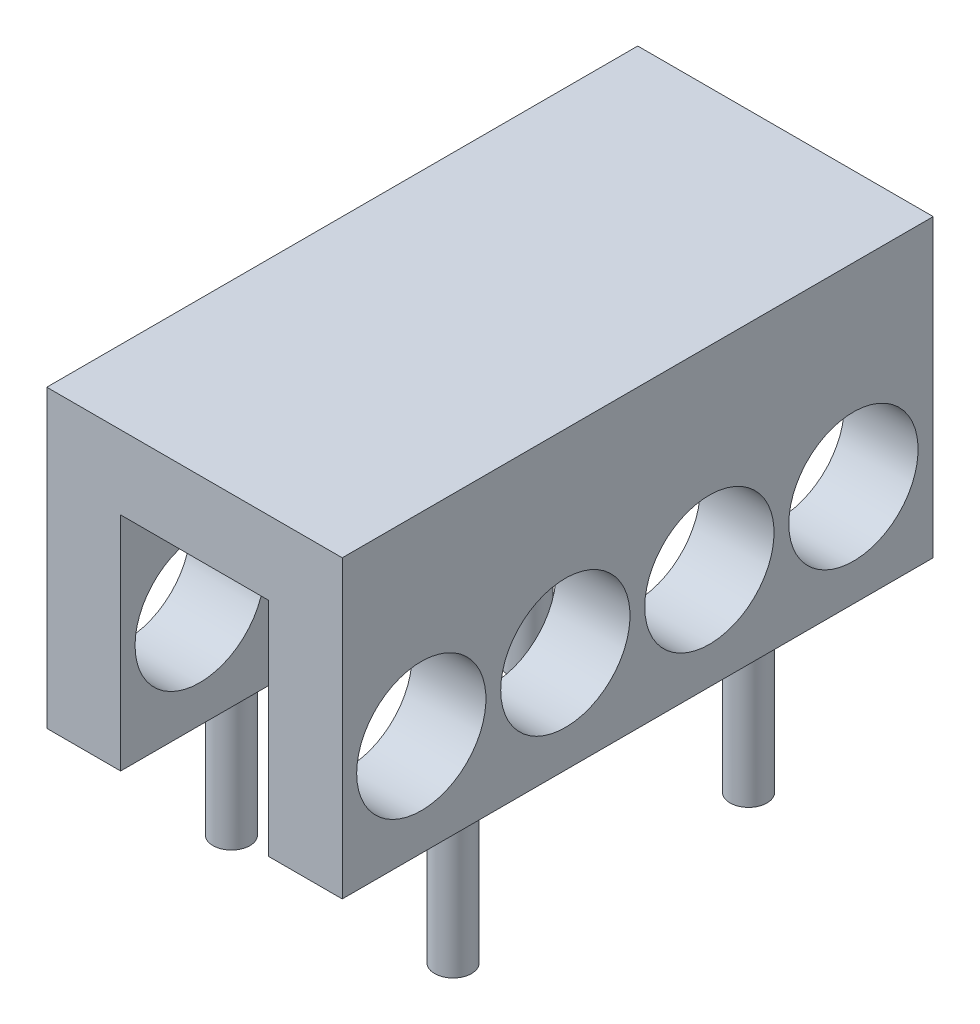
ISO-10303-21;
HEADER;
FILE_DESCRIPTION(('STEP AP214'),'2;1');
FILE_NAME('part.step','',(''),(''),'','','');
FILE_SCHEMA(('AUTOMOTIVE_DESIGN { 1 0 10303 214 1 1 1 1 }'));
ENDSEC;
DATA;
#1=APPLICATION_CONTEXT('core data for automotive mechanical design processes');
#2=APPLICATION_PROTOCOL_DEFINITION('international standard','automotive_design',2000,#1);
#3=PRODUCT_CONTEXT('',#1,'mechanical');
#4=PRODUCT('Part','Part','',(#3));
#5=PRODUCT_RELATED_PRODUCT_CATEGORY('part','',(#4));
#6=PRODUCT_DEFINITION_FORMATION('','',#4);
#7=PRODUCT_DEFINITION_CONTEXT('part definition',#1,'design');
#8=PRODUCT_DEFINITION('design','',#6,#7);
#9=PRODUCT_DEFINITION_SHAPE('','',#8);
#10=(LENGTH_UNIT() NAMED_UNIT(*) SI_UNIT(.MILLI.,.METRE.));
#11=(NAMED_UNIT(*) PLANE_ANGLE_UNIT() SI_UNIT($,.RADIAN.));
#12=(NAMED_UNIT(*) SI_UNIT($,.STERADIAN.) SOLID_ANGLE_UNIT());
#13=UNCERTAINTY_MEASURE_WITH_UNIT(LENGTH_MEASURE(1.E-05),#10,'distance_accuracy_value','');
#14=(GEOMETRIC_REPRESENTATION_CONTEXT(3) GLOBAL_UNCERTAINTY_ASSIGNED_CONTEXT((#13)) GLOBAL_UNIT_ASSIGNED_CONTEXT((#10,
#11,#12)) REPRESENTATION_CONTEXT('',''));
#15=CARTESIAN_POINT('',(0.,0.,0.));
#16=DIRECTION('',(0.,0.,1.));
#17=DIRECTION('',(1.,0.,0.));
#18=AXIS2_PLACEMENT_3D('',#15,#16,#17);
#19=CARTESIAN_POINT('',(12.7,0.,101.6));
#20=DIRECTION('',(0.,1.,0.));
#21=DIRECTION('',(-1.,0.,0.));
#22=AXIS2_PLACEMENT_3D('',#19,#20,#21);
#23=PLANE('',#22);
#24=CARTESIAN_POINT('',(6.35,0.,76.2));
#25=DIRECTION('',(0.,1.,0.));
#26=DIRECTION('',(-1.,0.,0.));
#27=AXIS2_PLACEMENT_3D('',#24,#25,#26);
#28=CIRCLE('',#27,3.175);
#29=CARTESIAN_POINT('',(3.175,0.,76.2));
#30=VERTEX_POINT('',#29);
#31=EDGE_CURVE('E190',#30,#30,#28,.F.);
#32=ORIENTED_EDGE('',*,*,#31,.F.);
#33=EDGE_LOOP('',(#32));
#34=FACE_BOUND('',#33,.T.);
#35=CARTESIAN_POINT('',(6.35,0.,25.4));
#36=DIRECTION('',(0.,1.,0.));
#37=DIRECTION('',(-1.,0.,0.));
#38=AXIS2_PLACEMENT_3D('',#35,#36,#37);
#39=CIRCLE('',#38,3.175);
#40=CARTESIAN_POINT('',(3.175,0.,25.4));
#41=VERTEX_POINT('',#40);
#42=EDGE_CURVE('E186',#41,#41,#39,.F.);
#43=ORIENTED_EDGE('',*,*,#42,.F.);
#44=EDGE_LOOP('',(#43));
#45=FACE_BOUND('',#44,.T.);
#46=DIRECTION('',(1.,0.,0.));
#47=VECTOR('',#46,1.);
#48=CARTESIAN_POINT('',(12.7,0.,0.));
#49=LINE('',#48,#47);
#50=CARTESIAN_POINT('',(0.,0.,0.));
#51=VERTEX_POINT('',#50);
#52=CARTESIAN_POINT('',(12.7,0.,0.));
#53=VERTEX_POINT('',#52);
#54=EDGE_CURVE('E141',#51,#53,#49,.T.);
#55=ORIENTED_EDGE('',*,*,#54,.T.);
#56=DIRECTION('',(0.,0.,-1.));
#57=VECTOR('',#56,1.);
#58=CARTESIAN_POINT('',(12.7,0.,101.6));
#59=LINE('',#58,#57);
#60=CARTESIAN_POINT('',(12.7,0.,101.6));
#61=VERTEX_POINT('',#60);
#62=EDGE_CURVE('E183',#61,#53,#59,.T.);
#63=ORIENTED_EDGE('',*,*,#62,.F.);
#64=DIRECTION('',(1.,0.,0.));
#65=VECTOR('',#64,1.);
#66=CARTESIAN_POINT('',(12.7,0.,101.6));
#67=LINE('',#66,#65);
#68=CARTESIAN_POINT('',(0.,0.,101.6));
#69=VERTEX_POINT('',#68);
#70=EDGE_CURVE('E164',#69,#61,#67,.T.);
#71=ORIENTED_EDGE('',*,*,#70,.F.);
#72=DIRECTION('',(0.,0.,-1.));
#73=VECTOR('',#72,1.);
#74=CARTESIAN_POINT('',(0.,0.,101.6));
#75=LINE('',#74,#73);
#76=EDGE_CURVE('E137',#69,#51,#75,.T.);
#77=ORIENTED_EDGE('',*,*,#76,.T.);
#78=EDGE_LOOP('',(#55,#63,#71,#77));
#79=FACE_BOUND('',#78,.T.);
#80=ADVANCED_FACE('F39',(#34,#45,#79),#23,.F.);
#81=CARTESIAN_POINT('',(12.7,38.1359773371105,101.6));
#82=DIRECTION('',(-1.,0.,0.));
#83=DIRECTION('',(0.,-1.,0.));
#84=AXIS2_PLACEMENT_3D('',#81,#82,#83);
#85=PLANE('',#84);
#86=CARTESIAN_POINT('',(12.7,17.4625,13.716));
#87=DIRECTION('',(-1.,0.,0.));
#88=DIRECTION('',(0.,-1.,0.));
#89=AXIS2_PLACEMENT_3D('',#86,#87,#88);
#90=CIRCLE('',#89,11.1125);
#91=CARTESIAN_POINT('',(12.7,6.35,13.716));
#92=VERTEX_POINT('',#91);
#93=EDGE_CURVE('E146',#92,#92,#90,.T.);
#94=ORIENTED_EDGE('',*,*,#93,.T.);
#95=EDGE_LOOP('',(#94));
#96=FACE_BOUND('',#95,.T.);
#97=CARTESIAN_POINT('',(12.7,17.4625,38.481));
#98=DIRECTION('',(-1.,0.,0.));
#99=DIRECTION('',(0.,-1.,0.));
#100=AXIS2_PLACEMENT_3D('',#97,#98,#99);
#101=CIRCLE('',#100,11.1125);
#102=CARTESIAN_POINT('',(12.7,6.35,38.481));
#103=VERTEX_POINT('',#102);
#104=EDGE_CURVE('E475',#103,#103,#101,.T.);
#105=ORIENTED_EDGE('',*,*,#104,.T.);
#106=EDGE_LOOP('',(#105));
#107=FACE_BOUND('',#106,.T.);
#108=CARTESIAN_POINT('',(12.7,17.4625,63.246));
#109=DIRECTION('',(-1.,0.,0.));
#110=DIRECTION('',(0.,-1.,0.));
#111=AXIS2_PLACEMENT_3D('',#108,#109,#110);
#112=CIRCLE('',#111,11.1125);
#113=CARTESIAN_POINT('',(12.7,6.35,63.246));
#114=VERTEX_POINT('',#113);
#115=EDGE_CURVE('E467',#114,#114,#112,.T.);
#116=ORIENTED_EDGE('',*,*,#115,.T.);
#117=EDGE_LOOP('',(#116));
#118=FACE_BOUND('',#117,.T.);
#119=CARTESIAN_POINT('',(12.7,17.4625,88.011));
#120=DIRECTION('',(-1.,0.,0.));
#121=DIRECTION('',(0.,-1.,0.));
#122=AXIS2_PLACEMENT_3D('',#119,#120,#121);
#123=CIRCLE('',#122,11.1125);
#124=CARTESIAN_POINT('',(12.7,6.35,88.011));
#125=VERTEX_POINT('',#124);
#126=EDGE_CURVE('E459',#125,#125,#123,.T.);
#127=ORIENTED_EDGE('',*,*,#126,.T.);
#128=EDGE_LOOP('',(#127));
#129=FACE_BOUND('',#128,.T.);
#130=DIRECTION('',(0.,1.,0.));
#131=VECTOR('',#130,1.);
#132=CARTESIAN_POINT('',(12.7,38.1359773371105,0.));
#133=LINE('',#132,#131);
#134=CARTESIAN_POINT('',(12.7,38.1359773371105,0.));
#135=VERTEX_POINT('',#134);
#136=EDGE_CURVE('E145',#53,#135,#133,.T.);
#137=ORIENTED_EDGE('',*,*,#136,.T.);
#138=DIRECTION('',(0.,0.,-1.));
#139=VECTOR('',#138,1.);
#140=CARTESIAN_POINT('',(12.7,38.1359773371105,101.6));
#141=LINE('',#140,#139);
#142=CARTESIAN_POINT('',(12.7,38.1359773371105,101.6));
#143=VERTEX_POINT('',#142);
#144=EDGE_CURVE('E179',#143,#135,#141,.T.);
#145=ORIENTED_EDGE('',*,*,#144,.F.);
#146=DIRECTION('',(0.,1.,0.));
#147=VECTOR('',#146,1.);
#148=CARTESIAN_POINT('',(12.7,38.1359773371105,101.6));
#149=LINE('',#148,#147);
#150=EDGE_CURVE('E100',#61,#143,#149,.T.);
#151=ORIENTED_EDGE('',*,*,#150,.F.);
#152=ORIENTED_EDGE('',*,*,#62,.T.);
#153=EDGE_LOOP('',(#137,#145,#151,#152));
#154=FACE_BOUND('',#153,.T.);
#155=ADVANCED_FACE('F229',(#96,#107,#118,#129,#154),#85,.F.);
#156=CARTESIAN_POINT('',(38.1,38.1359773371105,101.6));
#157=DIRECTION('',(0.,1.,0.));
#158=DIRECTION('',(0.,0.,1.));
#159=AXIS2_PLACEMENT_3D('',#156,#157,#158);
#160=PLANE('',#159);
#161=DIRECTION('',(1.,0.,0.));
#162=VECTOR('',#161,1.);
#163=CARTESIAN_POINT('',(38.1,38.1359773371105,0.));
#164=LINE('',#163,#162);
#165=CARTESIAN_POINT('',(38.1,38.1359773371105,0.));
#166=VERTEX_POINT('',#165);
#167=EDGE_CURVE('E149',#135,#166,#164,.T.);
#168=ORIENTED_EDGE('',*,*,#167,.T.);
#169=DIRECTION('',(0.,0.,-1.));
#170=VECTOR('',#169,1.);
#171=CARTESIAN_POINT('',(38.1,38.1359773371105,101.6));
#172=LINE('',#171,#170);
#173=CARTESIAN_POINT('',(38.1,38.1359773371105,101.6));
#174=VERTEX_POINT('',#173);
#175=EDGE_CURVE('E175',#174,#166,#172,.T.);
#176=ORIENTED_EDGE('',*,*,#175,.F.);
#177=DIRECTION('',(1.,0.,0.));
#178=VECTOR('',#177,1.);
#179=CARTESIAN_POINT('',(38.1,38.1359773371105,101.6));
#180=LINE('',#179,#178);
#181=EDGE_CURVE('E490',#143,#174,#180,.T.);
#182=ORIENTED_EDGE('',*,*,#181,.F.);
#183=ORIENTED_EDGE('',*,*,#144,.T.);
#184=EDGE_LOOP('',(#168,#176,#182,#183));
#185=FACE_BOUND('',#184,.T.);
#186=ADVANCED_FACE('F234',(#185),#160,.F.);
#187=CARTESIAN_POINT('',(38.1,0.,101.6));
#188=DIRECTION('',(1.,0.,0.));
#189=DIRECTION('',(0.,0.,-1.));
#190=AXIS2_PLACEMENT_3D('',#187,#188,#189);
#191=PLANE('',#190);
#192=CARTESIAN_POINT('',(38.1,17.4625,13.716));
#193=DIRECTION('',(1.,0.,0.));
#194=DIRECTION('',(0.,0.,-1.));
#195=AXIS2_PLACEMENT_3D('',#192,#193,#194);
#196=CIRCLE('',#195,11.1125);
#197=CARTESIAN_POINT('',(38.1,17.4625,2.60350000000001));
#198=VERTEX_POINT('',#197);
#199=EDGE_CURVE('E479',#198,#198,#196,.T.);
#200=ORIENTED_EDGE('',*,*,#199,.T.);
#201=EDGE_LOOP('',(#200));
#202=FACE_BOUND('',#201,.T.);
#203=CARTESIAN_POINT('',(38.1,17.4625,38.481));
#204=DIRECTION('',(1.,0.,0.));
#205=DIRECTION('',(0.,0.,-1.));
#206=AXIS2_PLACEMENT_3D('',#203,#204,#205);
#207=CIRCLE('',#206,11.1125);
#208=CARTESIAN_POINT('',(38.1,17.4625,27.3685));
#209=VERTEX_POINT('',#208);
#210=EDGE_CURVE('E471',#209,#209,#207,.T.);
#211=ORIENTED_EDGE('',*,*,#210,.T.);
#212=EDGE_LOOP('',(#211));
#213=FACE_BOUND('',#212,.T.);
#214=CARTESIAN_POINT('',(38.1,17.4625,63.246));
#215=DIRECTION('',(1.,0.,0.));
#216=DIRECTION('',(0.,0.,-1.));
#217=AXIS2_PLACEMENT_3D('',#214,#215,#216);
#218=CIRCLE('',#217,11.1125);
#219=CARTESIAN_POINT('',(38.1,17.4625,52.1335));
#220=VERTEX_POINT('',#219);
#221=EDGE_CURVE('E463',#220,#220,#218,.T.);
#222=ORIENTED_EDGE('',*,*,#221,.T.);
#223=EDGE_LOOP('',(#222));
#224=FACE_BOUND('',#223,.T.);
#225=CARTESIAN_POINT('',(38.1,17.4625,88.011));
#226=DIRECTION('',(1.,0.,0.));
#227=DIRECTION('',(0.,0.,-1.));
#228=AXIS2_PLACEMENT_3D('',#225,#226,#227);
#229=CIRCLE('',#228,11.1125);
#230=CARTESIAN_POINT('',(38.1,17.4625,76.8985));
#231=VERTEX_POINT('',#230);
#232=EDGE_CURVE('E428',#231,#231,#229,.T.);
#233=ORIENTED_EDGE('',*,*,#232,.T.);
#234=EDGE_LOOP('',(#233));
#235=FACE_BOUND('',#234,.T.);
#236=DIRECTION('',(0.,-1.,0.));
#237=VECTOR('',#236,1.);
#238=CARTESIAN_POINT('',(38.1,0.,0.));
#239=LINE('',#238,#237);
#240=CARTESIAN_POINT('',(38.1,0.,0.));
#241=VERTEX_POINT('',#240);
#242=EDGE_CURVE('E152',#166,#241,#239,.T.);
#243=ORIENTED_EDGE('',*,*,#242,.T.);
#244=DIRECTION('',(0.,0.,-1.));
#245=VECTOR('',#244,1.);
#246=CARTESIAN_POINT('',(38.1,0.,101.6));
#247=LINE('',#246,#245);
#248=CARTESIAN_POINT('',(38.1,0.,101.6));
#249=VERTEX_POINT('',#248);
#250=EDGE_CURVE('E171',#249,#241,#247,.T.);
#251=ORIENTED_EDGE('',*,*,#250,.F.);
#252=DIRECTION('',(0.,-1.,0.));
#253=VECTOR('',#252,1.);
#254=CARTESIAN_POINT('',(38.1,0.,101.6));
#255=LINE('',#254,#253);
#256=EDGE_CURVE('E493',#174,#249,#255,.T.);
#257=ORIENTED_EDGE('',*,*,#256,.F.);
#258=ORIENTED_EDGE('',*,*,#175,.T.);
#259=EDGE_LOOP('',(#243,#251,#257,#258));
#260=FACE_BOUND('',#259,.T.);
#261=ADVANCED_FACE('F202',(#202,#213,#224,#235,#260),#191,.F.);
#262=CARTESIAN_POINT('',(50.8,0.,101.6));
#263=DIRECTION('',(0.,1.,0.));
#264=DIRECTION('',(-1.,0.,0.));
#265=AXIS2_PLACEMENT_3D('',#262,#263,#264);
#266=PLANE('',#265);
#267=CARTESIAN_POINT('',(44.45,0.,25.4));
#268=DIRECTION('',(0.,1.,0.));
#269=DIRECTION('',(-1.,0.,0.));
#270=AXIS2_PLACEMENT_3D('',#267,#268,#269);
#271=CIRCLE('',#270,3.175);
#272=CARTESIAN_POINT('',(41.275,0.,25.4));
#273=VERTEX_POINT('',#272);
#274=EDGE_CURVE('E11',#273,#273,#271,.F.);
#275=ORIENTED_EDGE('',*,*,#274,.F.);
#276=EDGE_LOOP('',(#275));
#277=FACE_BOUND('',#276,.T.);
#278=CARTESIAN_POINT('',(44.45,0.,76.2));
#279=DIRECTION('',(0.,1.,0.));
#280=DIRECTION('',(-1.,0.,0.));
#281=AXIS2_PLACEMENT_3D('',#278,#279,#280);
#282=CIRCLE('',#281,3.175);
#283=CARTESIAN_POINT('',(41.275,0.,76.2));
#284=VERTEX_POINT('',#283);
#285=EDGE_CURVE('E48',#284,#284,#282,.F.);
#286=ORIENTED_EDGE('',*,*,#285,.F.);
#287=EDGE_LOOP('',(#286));
#288=FACE_BOUND('',#287,.T.);
#289=DIRECTION('',(1.,0.,0.));
#290=VECTOR('',#289,1.);
#291=CARTESIAN_POINT('',(50.8,0.,0.));
#292=LINE('',#291,#290);
#293=CARTESIAN_POINT('',(50.8,0.,0.));
#294=VERTEX_POINT('',#293);
#295=EDGE_CURVE('E155',#241,#294,#292,.T.);
#296=ORIENTED_EDGE('',*,*,#295,.T.);
#297=DIRECTION('',(0.,0.,-1.));
#298=VECTOR('',#297,1.);
#299=CARTESIAN_POINT('',(50.8,0.,101.6));
#300=LINE('',#299,#298);
#301=CARTESIAN_POINT('',(50.8,0.,101.6));
#302=VERTEX_POINT('',#301);
#303=EDGE_CURVE('E130',#302,#294,#300,.T.);
#304=ORIENTED_EDGE('',*,*,#303,.F.);
#305=DIRECTION('',(1.,0.,0.));
#306=VECTOR('',#305,1.);
#307=CARTESIAN_POINT('',(50.8,0.,101.6));
#308=LINE('',#307,#306);
#309=EDGE_CURVE('E119',#249,#302,#308,.T.);
#310=ORIENTED_EDGE('',*,*,#309,.F.);
#311=ORIENTED_EDGE('',*,*,#250,.T.);
#312=EDGE_LOOP('',(#296,#304,#310,#311));
#313=FACE_BOUND('',#312,.T.);
#314=ADVANCED_FACE('F199',(#277,#288,#313),#266,.F.);
#315=CARTESIAN_POINT('',(50.8,50.8,101.6));
#316=DIRECTION('',(-1.,0.,0.));
#317=DIRECTION('',(0.,-1.,0.));
#318=AXIS2_PLACEMENT_3D('',#315,#316,#317);
#319=PLANE('',#318);
#320=CARTESIAN_POINT('',(50.8,17.4625,13.716));
#321=DIRECTION('',(-1.,0.,0.));
#322=DIRECTION('',(0.,0.,1.));
#323=AXIS2_PLACEMENT_3D('',#320,#321,#322);
#324=CIRCLE('',#323,11.1125);
#325=CARTESIAN_POINT('',(50.8,17.4625,24.8285));
#326=VERTEX_POINT('',#325);
#327=EDGE_CURVE('E424',#326,#326,#324,.T.);
#328=ORIENTED_EDGE('',*,*,#327,.T.);
#329=EDGE_LOOP('',(#328));
#330=FACE_BOUND('',#329,.T.);
#331=CARTESIAN_POINT('',(50.8,17.4625,38.481));
#332=DIRECTION('',(-1.,0.,0.));
#333=DIRECTION('',(0.,0.,1.));
#334=AXIS2_PLACEMENT_3D('',#331,#332,#333);
#335=CIRCLE('',#334,11.1125);
#336=CARTESIAN_POINT('',(50.8,17.4625,49.5935));
#337=VERTEX_POINT('',#336);
#338=EDGE_CURVE('E433',#337,#337,#335,.T.);
#339=ORIENTED_EDGE('',*,*,#338,.T.);
#340=EDGE_LOOP('',(#339));
#341=FACE_BOUND('',#340,.T.);
#342=CARTESIAN_POINT('',(50.8,17.4625,63.246));
#343=DIRECTION('',(-1.,0.,0.));
#344=DIRECTION('',(0.,0.,1.));
#345=AXIS2_PLACEMENT_3D('',#342,#343,#344);
#346=CIRCLE('',#345,11.1125);
#347=CARTESIAN_POINT('',(50.8,17.4625,74.3585));
#348=VERTEX_POINT('',#347);
#349=EDGE_CURVE('E441',#348,#348,#346,.T.);
#350=ORIENTED_EDGE('',*,*,#349,.T.);
#351=EDGE_LOOP('',(#350));
#352=FACE_BOUND('',#351,.T.);
#353=CARTESIAN_POINT('',(50.8,17.4625,88.011));
#354=DIRECTION('',(-1.,0.,0.));
#355=DIRECTION('',(0.,0.,1.));
#356=AXIS2_PLACEMENT_3D('',#353,#354,#355);
#357=CIRCLE('',#356,11.1125);
#358=CARTESIAN_POINT('',(50.8,17.4625,99.1235));
#359=VERTEX_POINT('',#358);
#360=EDGE_CURVE('E449',#359,#359,#357,.T.);
#361=ORIENTED_EDGE('',*,*,#360,.T.);
#362=EDGE_LOOP('',(#361));
#363=FACE_BOUND('',#362,.T.);
#364=DIRECTION('',(0.,1.,0.));
#365=VECTOR('',#364,1.);
#366=CARTESIAN_POINT('',(50.8,50.8,0.));
#367=LINE('',#366,#365);
#368=CARTESIAN_POINT('',(50.8,50.8,0.));
#369=VERTEX_POINT('',#368);
#370=EDGE_CURVE('E128',#294,#369,#367,.T.);
#371=ORIENTED_EDGE('',*,*,#370,.T.);
#372=DIRECTION('',(0.,0.,-1.));
#373=VECTOR('',#372,1.);
#374=CARTESIAN_POINT('',(50.8,50.8,101.6));
#375=LINE('',#374,#373);
#376=CARTESIAN_POINT('',(50.8,50.8,101.6));
#377=VERTEX_POINT('',#376);
#378=EDGE_CURVE('E125',#377,#369,#375,.T.);
#379=ORIENTED_EDGE('',*,*,#378,.F.);
#380=DIRECTION('',(0.,1.,0.));
#381=VECTOR('',#380,1.);
#382=CARTESIAN_POINT('',(50.8,50.8,101.6));
#383=LINE('',#382,#381);
#384=EDGE_CURVE('E113',#302,#377,#383,.T.);
#385=ORIENTED_EDGE('',*,*,#384,.F.);
#386=ORIENTED_EDGE('',*,*,#303,.T.);
#387=EDGE_LOOP('',(#371,#379,#385,#386));
#388=FACE_BOUND('',#387,.T.);
#389=ADVANCED_FACE('F126',(#330,#341,#352,#363,#388),#319,.F.);
#390=CARTESIAN_POINT('',(0.,50.8,101.6));
#391=DIRECTION('',(0.,-1.,0.));
#392=DIRECTION('',(0.,0.,-1.));
#393=AXIS2_PLACEMENT_3D('',#390,#391,#392);
#394=PLANE('',#393);
#395=DIRECTION('',(-1.,0.,0.));
#396=VECTOR('',#395,1.);
#397=CARTESIAN_POINT('',(0.,50.8,0.));
#398=LINE('',#397,#396);
#399=CARTESIAN_POINT('',(0.,50.8,0.));
#400=VERTEX_POINT('',#399);
#401=EDGE_CURVE('E85',#369,#400,#398,.T.);
#402=ORIENTED_EDGE('',*,*,#401,.T.);
#403=DIRECTION('',(0.,0.,-1.));
#404=VECTOR('',#403,1.);
#405=CARTESIAN_POINT('',(0.,50.8,101.6));
#406=LINE('',#405,#404);
#407=CARTESIAN_POINT('',(0.,50.8,101.6));
#408=VERTEX_POINT('',#407);
#409=EDGE_CURVE('E131',#408,#400,#406,.T.);
#410=ORIENTED_EDGE('',*,*,#409,.F.);
#411=DIRECTION('',(-1.,0.,0.));
#412=VECTOR('',#411,1.);
#413=CARTESIAN_POINT('',(0.,50.8,101.6));
#414=LINE('',#413,#412);
#415=EDGE_CURVE('E117',#377,#408,#414,.T.);
#416=ORIENTED_EDGE('',*,*,#415,.F.);
#417=ORIENTED_EDGE('',*,*,#378,.T.);
#418=EDGE_LOOP('',(#402,#410,#416,#417));
#419=FACE_BOUND('',#418,.T.);
#420=ADVANCED_FACE('F133',(#419),#394,.F.);
#421=CARTESIAN_POINT('',(0.,0.,101.6));
#422=DIRECTION('',(1.,0.,0.));
#423=DIRECTION('',(0.,0.,-1.));
#424=AXIS2_PLACEMENT_3D('',#421,#422,#423);
#425=PLANE('',#424);
#426=CARTESIAN_POINT('',(0.,17.4625,13.716));
#427=DIRECTION('',(-1.,0.,0.));
#428=DIRECTION('',(0.,0.,1.));
#429=AXIS2_PLACEMENT_3D('',#426,#427,#428);
#430=CIRCLE('',#429,11.1125);
#431=CARTESIAN_POINT('',(0.,17.4625,24.8285));
#432=VERTEX_POINT('',#431);
#433=EDGE_CURVE('E429',#432,#432,#430,.T.);
#434=ORIENTED_EDGE('',*,*,#433,.F.);
#435=EDGE_LOOP('',(#434));
#436=FACE_BOUND('',#435,.T.);
#437=CARTESIAN_POINT('',(0.,17.4625,38.481));
#438=DIRECTION('',(-1.,0.,0.));
#439=DIRECTION('',(0.,0.,1.));
#440=AXIS2_PLACEMENT_3D('',#437,#438,#439);
#441=CIRCLE('',#440,11.1125);
#442=CARTESIAN_POINT('',(0.,17.4625,49.5935));
#443=VERTEX_POINT('',#442);
#444=EDGE_CURVE('E437',#443,#443,#441,.T.);
#445=ORIENTED_EDGE('',*,*,#444,.F.);
#446=EDGE_LOOP('',(#445));
#447=FACE_BOUND('',#446,.T.);
#448=CARTESIAN_POINT('',(0.,17.4625,63.246));
#449=DIRECTION('',(-1.,0.,0.));
#450=DIRECTION('',(0.,0.,1.));
#451=AXIS2_PLACEMENT_3D('',#448,#449,#450);
#452=CIRCLE('',#451,11.1125);
#453=CARTESIAN_POINT('',(0.,17.4625,74.3585));
#454=VERTEX_POINT('',#453);
#455=EDGE_CURVE('E445',#454,#454,#452,.T.);
#456=ORIENTED_EDGE('',*,*,#455,.F.);
#457=EDGE_LOOP('',(#456));
#458=FACE_BOUND('',#457,.T.);
#459=CARTESIAN_POINT('',(0.,17.4625,88.011));
#460=DIRECTION('',(-1.,0.,0.));
#461=DIRECTION('',(0.,0.,1.));
#462=AXIS2_PLACEMENT_3D('',#459,#460,#461);
#463=CIRCLE('',#462,11.1125);
#464=CARTESIAN_POINT('',(0.,17.4625,99.1235));
#465=VERTEX_POINT('',#464);
#466=EDGE_CURVE('E423',#465,#465,#463,.T.);
#467=ORIENTED_EDGE('',*,*,#466,.F.);
#468=EDGE_LOOP('',(#467));
#469=FACE_BOUND('',#468,.T.);
#470=DIRECTION('',(0.,-1.,0.));
#471=VECTOR('',#470,1.);
#472=CARTESIAN_POINT('',(0.,0.,0.));
#473=LINE('',#472,#471);
#474=EDGE_CURVE('E91',#400,#51,#473,.T.);
#475=ORIENTED_EDGE('',*,*,#474,.T.);
#476=ORIENTED_EDGE('',*,*,#76,.F.);
#477=DIRECTION('',(0.,-1.,0.));
#478=VECTOR('',#477,1.);
#479=CARTESIAN_POINT('',(0.,0.,101.6));
#480=LINE('',#479,#478);
#481=EDGE_CURVE('E56',#408,#69,#480,.T.);
#482=ORIENTED_EDGE('',*,*,#481,.F.);
#483=ORIENTED_EDGE('',*,*,#409,.T.);
#484=EDGE_LOOP('',(#475,#476,#482,#483));
#485=FACE_BOUND('',#484,.T.);
#486=ADVANCED_FACE('F215',(#436,#447,#458,#469,#485),#425,.F.);
#487=CARTESIAN_POINT('',(0.,0.,101.6));
#488=DIRECTION('',(0.,0.,-1.));
#489=DIRECTION('',(-1.,0.,0.));
#490=AXIS2_PLACEMENT_3D('',#487,#488,#489);
#491=PLANE('',#490);
#492=ORIENTED_EDGE('',*,*,#70,.T.);
#493=ORIENTED_EDGE('',*,*,#150,.T.);
#494=ORIENTED_EDGE('',*,*,#181,.T.);
#495=ORIENTED_EDGE('',*,*,#256,.T.);
#496=ORIENTED_EDGE('',*,*,#309,.T.);
#497=ORIENTED_EDGE('',*,*,#384,.T.);
#498=ORIENTED_EDGE('',*,*,#415,.T.);
#499=ORIENTED_EDGE('',*,*,#481,.T.);
#500=EDGE_LOOP('',(#492,#493,#494,#495,#496,#497,#498,#499));
#501=FACE_BOUND('',#500,.T.);
#502=ADVANCED_FACE('F115',(#501),#491,.F.);
#503=CARTESIAN_POINT('',(0.,0.,0.));
#504=DIRECTION('',(0.,0.,-1.));
#505=DIRECTION('',(-1.,0.,0.));
#506=AXIS2_PLACEMENT_3D('',#503,#504,#505);
#507=PLANE('',#506);
#508=ORIENTED_EDGE('',*,*,#54,.F.);
#509=ORIENTED_EDGE('',*,*,#474,.F.);
#510=ORIENTED_EDGE('',*,*,#401,.F.);
#511=ORIENTED_EDGE('',*,*,#370,.F.);
#512=ORIENTED_EDGE('',*,*,#295,.F.);
#513=ORIENTED_EDGE('',*,*,#242,.F.);
#514=ORIENTED_EDGE('',*,*,#167,.F.);
#515=ORIENTED_EDGE('',*,*,#136,.F.);
#516=EDGE_LOOP('',(#508,#509,#510,#511,#512,#513,#514,#515));
#517=FACE_BOUND('',#516,.T.);
#518=ADVANCED_FACE('F210',(#517),#507,.T.);
#519=CARTESIAN_POINT('',(50.8,17.4625,88.011));
#520=DIRECTION('',(-1.,0.,0.));
#521=DIRECTION('',(0.,0.,1.));
#522=AXIS2_PLACEMENT_3D('',#519,#520,#521);
#523=CYLINDRICAL_SURFACE('',#522,11.1125);
#524=ORIENTED_EDGE('',*,*,#466,.T.);
#525=EDGE_LOOP('',(#524));
#526=FACE_BOUND('',#525,.T.);
#527=ORIENTED_EDGE('',*,*,#126,.F.);
#528=EDGE_LOOP('',(#527));
#529=FACE_BOUND('',#528,.T.);
#530=ADVANCED_FACE('F270',(#526,#529),#523,.F.);
#531=CARTESIAN_POINT('',(50.8,17.4625,63.246));
#532=DIRECTION('',(-1.,0.,0.));
#533=DIRECTION('',(0.,0.,1.));
#534=AXIS2_PLACEMENT_3D('',#531,#532,#533);
#535=CYLINDRICAL_SURFACE('',#534,11.1125);
#536=ORIENTED_EDGE('',*,*,#455,.T.);
#537=EDGE_LOOP('',(#536));
#538=FACE_BOUND('',#537,.T.);
#539=ORIENTED_EDGE('',*,*,#115,.F.);
#540=EDGE_LOOP('',(#539));
#541=FACE_BOUND('',#540,.T.);
#542=ADVANCED_FACE('F266',(#538,#541),#535,.F.);
#543=CARTESIAN_POINT('',(50.8,17.4625,38.481));
#544=DIRECTION('',(-1.,0.,0.));
#545=DIRECTION('',(0.,0.,1.));
#546=AXIS2_PLACEMENT_3D('',#543,#544,#545);
#547=CYLINDRICAL_SURFACE('',#546,11.1125);
#548=ORIENTED_EDGE('',*,*,#444,.T.);
#549=EDGE_LOOP('',(#548));
#550=FACE_BOUND('',#549,.T.);
#551=ORIENTED_EDGE('',*,*,#104,.F.);
#552=EDGE_LOOP('',(#551));
#553=FACE_BOUND('',#552,.T.);
#554=ADVANCED_FACE('F262',(#550,#553),#547,.F.);
#555=CARTESIAN_POINT('',(50.8,17.4625,13.716));
#556=DIRECTION('',(-1.,0.,0.));
#557=DIRECTION('',(0.,0.,1.));
#558=AXIS2_PLACEMENT_3D('',#555,#556,#557);
#559=CYLINDRICAL_SURFACE('',#558,11.1125);
#560=ORIENTED_EDGE('',*,*,#433,.T.);
#561=EDGE_LOOP('',(#560));
#562=FACE_BOUND('',#561,.T.);
#563=ORIENTED_EDGE('',*,*,#93,.F.);
#564=EDGE_LOOP('',(#563));
#565=FACE_BOUND('',#564,.T.);
#566=ADVANCED_FACE('F256',(#562,#565),#559,.F.);
#567=ORIENTED_EDGE('',*,*,#360,.F.);
#568=EDGE_LOOP('',(#567));
#569=FACE_BOUND('',#568,.T.);
#570=ORIENTED_EDGE('',*,*,#232,.F.);
#571=EDGE_LOOP('',(#570));
#572=FACE_BOUND('',#571,.T.);
#573=ADVANCED_FACE('F261',(#569,#572),#523,.F.);
#574=ORIENTED_EDGE('',*,*,#349,.F.);
#575=EDGE_LOOP('',(#574));
#576=FACE_BOUND('',#575,.T.);
#577=ORIENTED_EDGE('',*,*,#221,.F.);
#578=EDGE_LOOP('',(#577));
#579=FACE_BOUND('',#578,.T.);
#580=ADVANCED_FACE('F272',(#576,#579),#535,.F.);
#581=ORIENTED_EDGE('',*,*,#338,.F.);
#582=EDGE_LOOP('',(#581));
#583=FACE_BOUND('',#582,.T.);
#584=ORIENTED_EDGE('',*,*,#210,.F.);
#585=EDGE_LOOP('',(#584));
#586=FACE_BOUND('',#585,.T.);
#587=ADVANCED_FACE('F253',(#583,#586),#547,.F.);
#588=ORIENTED_EDGE('',*,*,#327,.F.);
#589=EDGE_LOOP('',(#588));
#590=FACE_BOUND('',#589,.T.);
#591=ORIENTED_EDGE('',*,*,#199,.F.);
#592=EDGE_LOOP('',(#591));
#593=FACE_BOUND('',#592,.T.);
#594=ADVANCED_FACE('F243',(#590,#593),#559,.F.);
#595=CARTESIAN_POINT('',(6.35,-25.4,25.4));
#596=DIRECTION('',(0.,1.,0.));
#597=DIRECTION('',(-1.,0.,0.));
#598=AXIS2_PLACEMENT_3D('',#595,#596,#597);
#599=CYLINDRICAL_SURFACE('',#598,3.175);
#600=CARTESIAN_POINT('',(6.35,-25.4,25.4));
#601=DIRECTION('',(0.,-1.,0.));
#602=DIRECTION('',(1.,0.,0.));
#603=AXIS2_PLACEMENT_3D('',#600,#601,#602);
#604=CIRCLE('',#603,3.175);
#605=CARTESIAN_POINT('',(9.525,-25.4,25.4));
#606=VERTEX_POINT('',#605);
#607=EDGE_CURVE('E419',#606,#606,#604,.T.);
#608=ORIENTED_EDGE('',*,*,#607,.F.);
#609=EDGE_LOOP('',(#608));
#610=FACE_BOUND('',#609,.T.);
#611=ORIENTED_EDGE('',*,*,#42,.T.);
#612=EDGE_LOOP('',(#611));
#613=FACE_BOUND('',#612,.T.);
#614=ADVANCED_FACE('F240',(#610,#613),#599,.T.);
#615=CARTESIAN_POINT('',(6.35,-25.4,25.4));
#616=DIRECTION('',(0.,-1.,0.));
#617=DIRECTION('',(1.,0.,0.));
#618=AXIS2_PLACEMENT_3D('',#615,#616,#617);
#619=PLANE('',#618);
#620=ORIENTED_EDGE('',*,*,#607,.T.);
#621=EDGE_LOOP('',(#620));
#622=FACE_BOUND('',#621,.T.);
#623=ADVANCED_FACE('F242',(#622),#619,.T.);
#624=CARTESIAN_POINT('',(6.35,-25.4,76.2));
#625=DIRECTION('',(0.,1.,0.));
#626=DIRECTION('',(-1.,0.,0.));
#627=AXIS2_PLACEMENT_3D('',#624,#625,#626);
#628=CYLINDRICAL_SURFACE('',#627,3.175);
#629=CARTESIAN_POINT('',(6.35,-25.4,76.2));
#630=DIRECTION('',(0.,-1.,0.));
#631=DIRECTION('',(1.,0.,0.));
#632=AXIS2_PLACEMENT_3D('',#629,#630,#631);
#633=CIRCLE('',#632,3.175);
#634=CARTESIAN_POINT('',(9.525,-25.4,76.2));
#635=VERTEX_POINT('',#634);
#636=EDGE_CURVE('E413',#635,#635,#633,.T.);
#637=ORIENTED_EDGE('',*,*,#636,.F.);
#638=EDGE_LOOP('',(#637));
#639=FACE_BOUND('',#638,.T.);
#640=ORIENTED_EDGE('',*,*,#31,.T.);
#641=EDGE_LOOP('',(#640));
#642=FACE_BOUND('',#641,.T.);
#643=ADVANCED_FACE('F250',(#639,#642),#628,.T.);
#644=CARTESIAN_POINT('',(6.35,-25.4,76.2));
#645=DIRECTION('',(0.,-1.,0.));
#646=DIRECTION('',(1.,0.,0.));
#647=AXIS2_PLACEMENT_3D('',#644,#645,#646);
#648=PLANE('',#647);
#649=ORIENTED_EDGE('',*,*,#636,.T.);
#650=EDGE_LOOP('',(#649));
#651=FACE_BOUND('',#650,.T.);
#652=ADVANCED_FACE('F353',(#651),#648,.T.);
#653=CARTESIAN_POINT('',(44.45,-25.4,76.2));
#654=DIRECTION('',(0.,1.,0.));
#655=DIRECTION('',(-1.,0.,0.));
#656=AXIS2_PLACEMENT_3D('',#653,#654,#655);
#657=CYLINDRICAL_SURFACE('',#656,3.175);
#658=CARTESIAN_POINT('',(44.45,-25.4,76.2));
#659=DIRECTION('',(0.,-1.,0.));
#660=DIRECTION('',(1.,0.,0.));
#661=AXIS2_PLACEMENT_3D('',#658,#659,#660);
#662=CIRCLE('',#661,3.175);
#663=CARTESIAN_POINT('',(47.625,-25.4,76.2));
#664=VERTEX_POINT('',#663);
#665=EDGE_CURVE('E409',#664,#664,#662,.T.);
#666=ORIENTED_EDGE('',*,*,#665,.F.);
#667=EDGE_LOOP('',(#666));
#668=FACE_BOUND('',#667,.T.);
#669=ORIENTED_EDGE('',*,*,#285,.T.);
#670=EDGE_LOOP('',(#669));
#671=FACE_BOUND('',#670,.T.);
#672=ADVANCED_FACE('F197',(#668,#671),#657,.T.);
#673=CARTESIAN_POINT('',(44.45,-25.4,76.2));
#674=DIRECTION('',(0.,-1.,0.));
#675=DIRECTION('',(1.,0.,0.));
#676=AXIS2_PLACEMENT_3D('',#673,#674,#675);
#677=PLANE('',#676);
#678=ORIENTED_EDGE('',*,*,#665,.T.);
#679=EDGE_LOOP('',(#678));
#680=FACE_BOUND('',#679,.T.);
#681=ADVANCED_FACE('F371',(#680),#677,.T.);
#682=CARTESIAN_POINT('',(44.45,-25.4,25.4));
#683=DIRECTION('',(0.,1.,0.));
#684=DIRECTION('',(-1.,0.,0.));
#685=AXIS2_PLACEMENT_3D('',#682,#683,#684);
#686=CYLINDRICAL_SURFACE('',#685,3.175);
#687=CARTESIAN_POINT('',(44.45,-25.4,25.4));
#688=DIRECTION('',(0.,-1.,0.));
#689=DIRECTION('',(1.,0.,0.));
#690=AXIS2_PLACEMENT_3D('',#687,#688,#689);
#691=CIRCLE('',#690,3.175);
#692=CARTESIAN_POINT('',(47.625,-25.4,25.4));
#693=VERTEX_POINT('',#692);
#694=EDGE_CURVE('E407',#693,#693,#691,.T.);
#695=ORIENTED_EDGE('',*,*,#694,.F.);
#696=EDGE_LOOP('',(#695));
#697=FACE_BOUND('',#696,.T.);
#698=ORIENTED_EDGE('',*,*,#274,.T.);
#699=EDGE_LOOP('',(#698));
#700=FACE_BOUND('',#699,.T.);
#701=ADVANCED_FACE('F381',(#697,#700),#686,.T.);
#702=CARTESIAN_POINT('',(44.45,-25.4,25.4));
#703=DIRECTION('',(0.,-1.,0.));
#704=DIRECTION('',(1.,0.,0.));
#705=AXIS2_PLACEMENT_3D('',#702,#703,#704);
#706=PLANE('',#705);
#707=ORIENTED_EDGE('',*,*,#694,.T.);
#708=EDGE_LOOP('',(#707));
#709=FACE_BOUND('',#708,.T.);
#710=ADVANCED_FACE('F391',(#709),#706,.T.);
#711=CLOSED_SHELL('',(#80,#155,#186,#261,#314,#389,#420,#486,#502,#518,#530,#542,#554,#566,#573,
#580,#587,#594,#614,#623,#643,#652,#672,#681,#701,#710));
#712=MANIFOLD_SOLID_BREP('B2',#711);
#713=ADVANCED_BREP_SHAPE_REPRESENTATION('',(#18,#712),#14);
#714=SHAPE_DEFINITION_REPRESENTATION(#9,#713);
ENDSEC;
END-ISO-10303-21;
